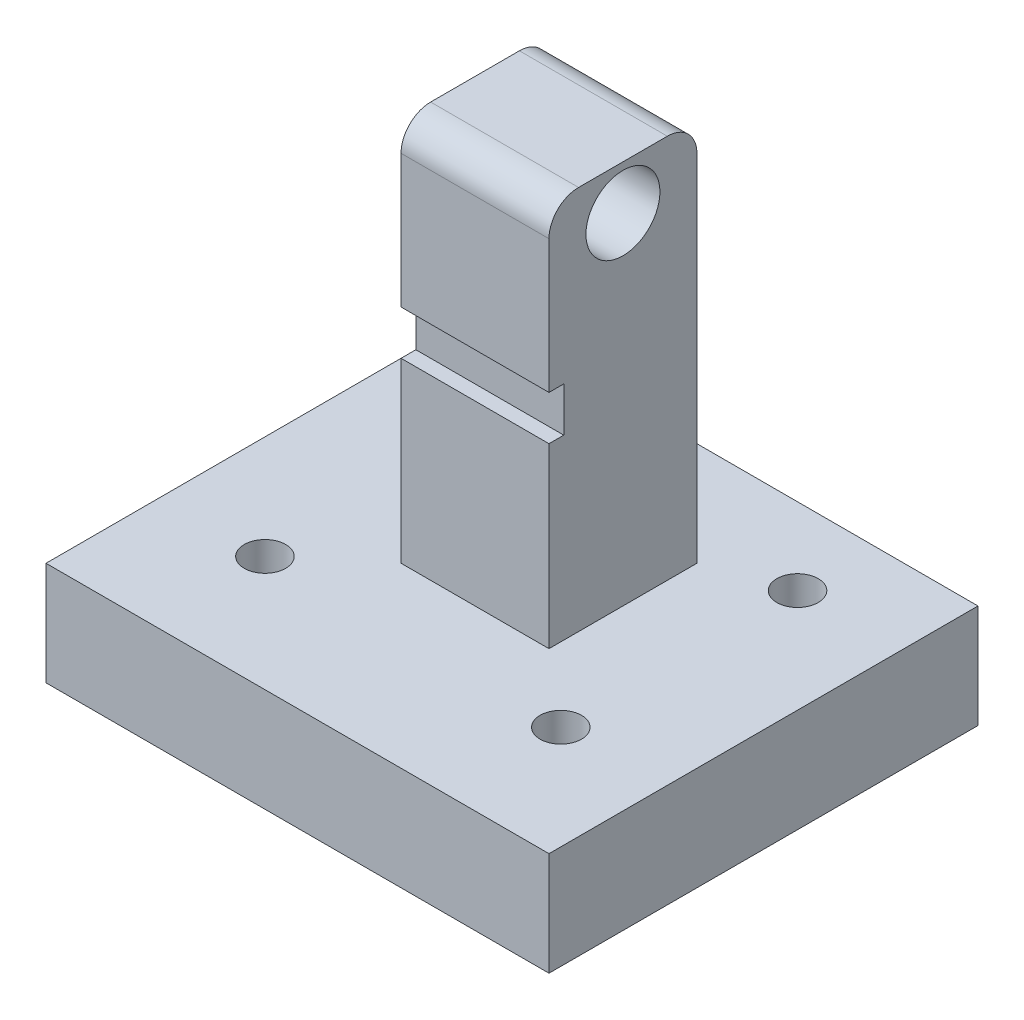
ISO-10303-21;
HEADER;
FILE_DESCRIPTION(('STEP AP214'),'2;1');
FILE_NAME('part.step','',(''),(''),'','','');
FILE_SCHEMA(('AUTOMOTIVE_DESIGN { 1 0 10303 214 1 1 1 1 }'));
ENDSEC;
DATA;
#1=APPLICATION_CONTEXT('core data for automotive mechanical design processes');
#2=APPLICATION_PROTOCOL_DEFINITION('international standard','automotive_design',2000,#1);
#3=PRODUCT_CONTEXT('',#1,'mechanical');
#4=PRODUCT('Part','Part','',(#3));
#5=PRODUCT_RELATED_PRODUCT_CATEGORY('part','',(#4));
#6=PRODUCT_DEFINITION_FORMATION('','',#4);
#7=PRODUCT_DEFINITION_CONTEXT('part definition',#1,'design');
#8=PRODUCT_DEFINITION('design','',#6,#7);
#9=PRODUCT_DEFINITION_SHAPE('','',#8);
#10=(LENGTH_UNIT() NAMED_UNIT(*) SI_UNIT(.MILLI.,.METRE.));
#11=(NAMED_UNIT(*) PLANE_ANGLE_UNIT() SI_UNIT($,.RADIAN.));
#12=(NAMED_UNIT(*) SI_UNIT($,.STERADIAN.) SOLID_ANGLE_UNIT());
#13=UNCERTAINTY_MEASURE_WITH_UNIT(LENGTH_MEASURE(1.E-05),#10,'distance_accuracy_value','');
#14=(GEOMETRIC_REPRESENTATION_CONTEXT(3) GLOBAL_UNCERTAINTY_ASSIGNED_CONTEXT((#13)) GLOBAL_UNIT_ASSIGNED_CONTEXT((#10,
#11,#12)) REPRESENTATION_CONTEXT('',''));
#15=CARTESIAN_POINT('',(0.,0.,0.));
#16=DIRECTION('',(0.,0.,1.));
#17=DIRECTION('',(1.,0.,0.));
#18=AXIS2_PLACEMENT_3D('',#15,#16,#17);
#19=CARTESIAN_POINT('',(0.,0.,10.));
#20=DIRECTION('',(0.,0.,1.));
#21=DIRECTION('',(1.,0.,0.));
#22=AXIS2_PLACEMENT_3D('',#19,#20,#21);
#23=PLANE('',#22);
#24=DIRECTION('',(-1.,0.,0.));
#25=VECTOR('',#24,1.);
#26=CARTESIAN_POINT('',(-61.75,-71.3750000000001,10.));
#27=LINE('',#26,#25);
#28=CARTESIAN_POINT('',(-51.75,-71.3750000000001,10.));
#29=VERTEX_POINT('',#28);
#30=CARTESIAN_POINT('',(-61.75,-71.3750000000001,10.));
#31=VERTEX_POINT('',#30);
#32=EDGE_CURVE('E166',#29,#31,#27,.T.);
#33=ORIENTED_EDGE('',*,*,#32,.F.);
#34=DIRECTION('',(0.,1.,0.));
#35=VECTOR('',#34,1.);
#36=CARTESIAN_POINT('',(-51.75,0.,10.));
#37=LINE('',#36,#35);
#38=CARTESIAN_POINT('',(-51.75,-62.3750000000001,10.));
#39=VERTEX_POINT('',#38);
#40=EDGE_CURVE('E266',#29,#39,#37,.T.);
#41=ORIENTED_EDGE('',*,*,#40,.T.);
#42=DIRECTION('',(-1.,0.,0.));
#43=VECTOR('',#42,1.);
#44=CARTESIAN_POINT('',(-61.75,-62.3750000000001,10.));
#45=LINE('',#44,#43);
#46=CARTESIAN_POINT('',(-61.75,-62.3750000000001,10.));
#47=VERTEX_POINT('',#46);
#48=EDGE_CURVE('E299',#39,#47,#45,.T.);
#49=ORIENTED_EDGE('',*,*,#48,.T.);
#50=DIRECTION('',(0.,-1.,0.));
#51=VECTOR('',#50,1.);
#52=CARTESIAN_POINT('',(-61.75,0.,10.));
#53=LINE('',#52,#51);
#54=EDGE_CURVE('E274',#47,#31,#53,.T.);
#55=ORIENTED_EDGE('',*,*,#54,.T.);
#56=EDGE_LOOP('',(#33,#41,#49,#55));
#57=FACE_BOUND('',#56,.T.);
#58=ADVANCED_FACE('F47',(#57),#23,.T.);
#59=CARTESIAN_POINT('',(-73.75,88.375,10.));
#60=DIRECTION('',(1.,0.,0.));
#61=DIRECTION('',(0.,1.,0.));
#62=AXIS2_PLACEMENT_3D('',#59,#60,#61);
#63=PLANE('',#62);
#64=DIRECTION('',(0.,0.,1.));
#65=VECTOR('',#64,1.);
#66=CARTESIAN_POINT('',(-73.75,-86.3750000000001,-7.));
#67=LINE('',#66,#65);
#68=CARTESIAN_POINT('',(-73.75,-86.3750000000001,-7.));
#69=VERTEX_POINT('',#68);
#70=CARTESIAN_POINT('',(-73.75,-86.3750000000001,22.));
#71=VERTEX_POINT('',#70);
#72=EDGE_CURVE('E72',#69,#71,#67,.T.);
#73=ORIENTED_EDGE('',*,*,#72,.F.);
#74=DIRECTION('',(0.,-1.,0.));
#75=VECTOR('',#74,1.);
#76=CARTESIAN_POINT('',(-73.75,-88.3750000000001,-7.));
#77=LINE('',#76,#75);
#78=CARTESIAN_POINT('',(-73.75,-93.375,-7.));
#79=VERTEX_POINT('',#78);
#80=EDGE_CURVE('E279',#69,#79,#77,.T.);
#81=ORIENTED_EDGE('',*,*,#80,.T.);
#82=DIRECTION('',(0.,0.,-1.));
#83=VECTOR('',#82,1.);
#84=CARTESIAN_POINT('',(-73.75,-93.375,22.));
#85=LINE('',#84,#83);
#86=CARTESIAN_POINT('',(-73.75,-93.375,22.));
#87=VERTEX_POINT('',#86);
#88=EDGE_CURVE('E237',#87,#79,#85,.T.);
#89=ORIENTED_EDGE('',*,*,#88,.F.);
#90=DIRECTION('',(0.,1.,0.));
#91=VECTOR('',#90,1.);
#92=CARTESIAN_POINT('',(-73.75,-88.3750000000001,22.));
#93=LINE('',#92,#91);
#94=EDGE_CURVE('E282',#87,#71,#93,.T.);
#95=ORIENTED_EDGE('',*,*,#94,.T.);
#96=EDGE_LOOP('',(#73,#81,#89,#95));
#97=FACE_BOUND('',#96,.T.);
#98=ADVANCED_FACE('F359',(#97),#63,.F.);
#99=CARTESIAN_POINT('',(-39.75,0.,0.));
#100=DIRECTION('',(-1.,0.,0.));
#101=DIRECTION('',(0.,0.,1.));
#102=AXIS2_PLACEMENT_3D('',#99,#100,#101);
#103=PLANE('',#102);
#104=DIRECTION('',(0.,0.,-1.));
#105=VECTOR('',#104,1.);
#106=CARTESIAN_POINT('',(-39.75,-86.3750000000001,-7.));
#107=LINE('',#106,#105);
#108=CARTESIAN_POINT('',(-39.75,-86.3750000000001,22.));
#109=VERTEX_POINT('',#108);
#110=CARTESIAN_POINT('',(-39.75,-86.3750000000001,-7.));
#111=VERTEX_POINT('',#110);
#112=EDGE_CURVE('E203',#109,#111,#107,.T.);
#113=ORIENTED_EDGE('',*,*,#112,.F.);
#114=DIRECTION('',(0.,1.,0.));
#115=VECTOR('',#114,1.);
#116=CARTESIAN_POINT('',(-39.75,-88.3750000000001,22.));
#117=LINE('',#116,#115);
#118=CARTESIAN_POINT('',(-39.75,-93.375,22.));
#119=VERTEX_POINT('',#118);
#120=EDGE_CURVE('E283',#119,#109,#117,.T.);
#121=ORIENTED_EDGE('',*,*,#120,.F.);
#122=DIRECTION('',(0.,0.,1.));
#123=VECTOR('',#122,1.);
#124=CARTESIAN_POINT('',(-39.75,-93.375,22.));
#125=LINE('',#124,#123);
#126=CARTESIAN_POINT('',(-39.75,-93.375,-7.));
#127=VERTEX_POINT('',#126);
#128=EDGE_CURVE('E245',#127,#119,#125,.T.);
#129=ORIENTED_EDGE('',*,*,#128,.F.);
#130=DIRECTION('',(0.,-1.,0.));
#131=VECTOR('',#130,1.);
#132=CARTESIAN_POINT('',(-39.75,-88.3750000000001,-7.));
#133=LINE('',#132,#131);
#134=EDGE_CURVE('E278',#111,#127,#133,.T.);
#135=ORIENTED_EDGE('',*,*,#134,.F.);
#136=EDGE_LOOP('',(#113,#121,#129,#135));
#137=FACE_BOUND('',#136,.T.);
#138=ADVANCED_FACE('F367',(#137),#103,.F.);
#139=CARTESIAN_POINT('',(-39.75,-88.3750000000001,-7.));
#140=DIRECTION('',(0.,0.,-1.));
#141=DIRECTION('',(0.,1.,0.));
#142=AXIS2_PLACEMENT_3D('',#139,#140,#141);
#143=PLANE('',#142);
#144=ORIENTED_EDGE('',*,*,#80,.F.);
#145=DIRECTION('',(-1.,0.,0.));
#146=VECTOR('',#145,1.);
#147=CARTESIAN_POINT('',(-73.75,-86.3750000000001,-7.));
#148=LINE('',#147,#146);
#149=EDGE_CURVE('E206',#111,#69,#148,.T.);
#150=ORIENTED_EDGE('',*,*,#149,.F.);
#151=ORIENTED_EDGE('',*,*,#134,.T.);
#152=DIRECTION('',(1.,0.,0.));
#153=VECTOR('',#152,1.);
#154=CARTESIAN_POINT('',(-73.75,-93.375,-7.));
#155=LINE('',#154,#153);
#156=EDGE_CURVE('E241',#79,#127,#155,.T.);
#157=ORIENTED_EDGE('',*,*,#156,.F.);
#158=EDGE_LOOP('',(#144,#150,#151,#157));
#159=FACE_BOUND('',#158,.T.);
#160=ADVANCED_FACE('F408',(#159),#143,.T.);
#161=CARTESIAN_POINT('',(-39.75,-88.3750000000001,22.));
#162=DIRECTION('',(0.,0.,1.));
#163=DIRECTION('',(1.,0.,0.));
#164=AXIS2_PLACEMENT_3D('',#161,#162,#163);
#165=PLANE('',#164);
#166=ORIENTED_EDGE('',*,*,#120,.T.);
#167=DIRECTION('',(1.,0.,0.));
#168=VECTOR('',#167,1.);
#169=CARTESIAN_POINT('',(-73.75,-86.3750000000001,22.));
#170=LINE('',#169,#168);
#171=EDGE_CURVE('E200',#71,#109,#170,.T.);
#172=ORIENTED_EDGE('',*,*,#171,.F.);
#173=ORIENTED_EDGE('',*,*,#94,.F.);
#174=DIRECTION('',(-1.,0.,0.));
#175=VECTOR('',#174,1.);
#176=CARTESIAN_POINT('',(-73.75,-93.375,22.));
#177=LINE('',#176,#175);
#178=EDGE_CURVE('E249',#119,#87,#177,.T.);
#179=ORIENTED_EDGE('',*,*,#178,.F.);
#180=EDGE_LOOP('',(#166,#172,#173,#179));
#181=FACE_BOUND('',#180,.T.);
#182=ADVANCED_FACE('F405',(#181),#165,.T.);
#183=CARTESIAN_POINT('',(-46.75,-54.375,-1.8));
#184=DIRECTION('',(0.,-1.,0.));
#185=DIRECTION('',(0.,0.,-1.));
#186=AXIS2_PLACEMENT_3D('',#183,#184,#185);
#187=CYLINDRICAL_SURFACE('',#186,1.4);
#188=CARTESIAN_POINT('',(-46.7499999999999,-93.375,-1.80000000000014));
#189=DIRECTION('',(0.,-1.,0.));
#190=DIRECTION('',(0.,0.,-1.));
#191=AXIS2_PLACEMENT_3D('',#188,#189,#190);
#192=CIRCLE('',#191,1.39999999999999);
#193=CARTESIAN_POINT('',(-46.7499999999999,-93.375,-3.20000000000013));
#194=VERTEX_POINT('',#193);
#195=EDGE_CURVE('E225',#194,#194,#192,.T.);
#196=ORIENTED_EDGE('',*,*,#195,.T.);
#197=EDGE_LOOP('',(#196));
#198=FACE_BOUND('',#197,.T.);
#199=CARTESIAN_POINT('',(-46.75,-86.3750000000001,-1.8));
#200=DIRECTION('',(0.,1.,0.));
#201=DIRECTION('',(0.,0.,1.));
#202=AXIS2_PLACEMENT_3D('',#199,#200,#201);
#203=CIRCLE('',#202,1.4);
#204=CARTESIAN_POINT('',(-46.75,-86.3750000000001,-0.400000000000005));
#205=VERTEX_POINT('',#204);
#206=EDGE_CURVE('E217',#205,#205,#203,.F.);
#207=ORIENTED_EDGE('',*,*,#206,.F.);
#208=EDGE_LOOP('',(#207));
#209=FACE_BOUND('',#208,.T.);
#210=ADVANCED_FACE('F402',(#198,#209),#187,.F.);
#211=CARTESIAN_POINT('',(-66.75,-54.375,-1.80000000000014));
#212=DIRECTION('',(0.,-1.,0.));
#213=DIRECTION('',(0.,0.,-1.));
#214=AXIS2_PLACEMENT_3D('',#211,#212,#213);
#215=CYLINDRICAL_SURFACE('',#214,1.39999999999999);
#216=CARTESIAN_POINT('',(-66.7499999999999,-93.375,-1.80000000000014));
#217=DIRECTION('',(0.,-1.,0.));
#218=DIRECTION('',(0.,0.,-1.));
#219=AXIS2_PLACEMENT_3D('',#216,#217,#218);
#220=CIRCLE('',#219,1.39999999999999);
#221=CARTESIAN_POINT('',(-66.7499999999999,-93.375,-3.20000000000013));
#222=VERTEX_POINT('',#221);
#223=EDGE_CURVE('E221',#222,#222,#220,.T.);
#224=ORIENTED_EDGE('',*,*,#223,.T.);
#225=EDGE_LOOP('',(#224));
#226=FACE_BOUND('',#225,.T.);
#227=CARTESIAN_POINT('',(-66.75,-86.3750000000001,-1.80000000000014));
#228=DIRECTION('',(0.,1.,0.));
#229=DIRECTION('',(0.,0.,1.));
#230=AXIS2_PLACEMENT_3D('',#227,#228,#229);
#231=CIRCLE('',#230,1.39999999999999);
#232=CARTESIAN_POINT('',(-66.75,-86.3750000000001,-0.400000000000151));
#233=VERTEX_POINT('',#232);
#234=EDGE_CURVE('E213',#233,#233,#231,.F.);
#235=ORIENTED_EDGE('',*,*,#234,.F.);
#236=EDGE_LOOP('',(#235));
#237=FACE_BOUND('',#236,.T.);
#238=ADVANCED_FACE('F440',(#226,#237),#215,.F.);
#239=CARTESIAN_POINT('',(-66.75,-54.375,14.1999999999999));
#240=DIRECTION('',(0.,-1.,0.));
#241=DIRECTION('',(0.,0.,-1.));
#242=AXIS2_PLACEMENT_3D('',#239,#240,#241);
#243=CYLINDRICAL_SURFACE('',#242,1.39999999999999);
#244=CARTESIAN_POINT('',(-66.75,-93.375,14.1999999999999));
#245=DIRECTION('',(0.,-1.,0.));
#246=DIRECTION('',(0.,0.,-1.));
#247=AXIS2_PLACEMENT_3D('',#244,#245,#246);
#248=CIRCLE('',#247,1.39999999999999);
#249=CARTESIAN_POINT('',(-66.75,-93.375,12.7999999999999));
#250=VERTEX_POINT('',#249);
#251=EDGE_CURVE('E233',#250,#250,#248,.T.);
#252=ORIENTED_EDGE('',*,*,#251,.T.);
#253=EDGE_LOOP('',(#252));
#254=FACE_BOUND('',#253,.T.);
#255=CARTESIAN_POINT('',(-66.75,-86.3750000000001,14.1999999999999));
#256=DIRECTION('',(0.,1.,0.));
#257=DIRECTION('',(0.,0.,1.));
#258=AXIS2_PLACEMENT_3D('',#255,#256,#257);
#259=CIRCLE('',#258,1.39999999999999);
#260=CARTESIAN_POINT('',(-66.75,-86.3750000000001,15.5999999999999));
#261=VERTEX_POINT('',#260);
#262=EDGE_CURVE('E209',#261,#261,#259,.F.);
#263=ORIENTED_EDGE('',*,*,#262,.F.);
#264=EDGE_LOOP('',(#263));
#265=FACE_BOUND('',#264,.T.);
#266=ADVANCED_FACE('F445',(#254,#265),#243,.F.);
#267=CARTESIAN_POINT('',(-46.75,-54.375,14.2));
#268=DIRECTION('',(0.,-1.,0.));
#269=DIRECTION('',(0.,0.,-1.));
#270=AXIS2_PLACEMENT_3D('',#267,#268,#269);
#271=CYLINDRICAL_SURFACE('',#270,1.4);
#272=CARTESIAN_POINT('',(-46.75,-93.375,14.1999999999999));
#273=DIRECTION('',(0.,-1.,0.));
#274=DIRECTION('',(0.,0.,-1.));
#275=AXIS2_PLACEMENT_3D('',#272,#273,#274);
#276=CIRCLE('',#275,1.39999999999999);
#277=CARTESIAN_POINT('',(-46.75,-93.375,12.7999999999999));
#278=VERTEX_POINT('',#277);
#279=EDGE_CURVE('E229',#278,#278,#276,.T.);
#280=ORIENTED_EDGE('',*,*,#279,.T.);
#281=EDGE_LOOP('',(#280));
#282=FACE_BOUND('',#281,.T.);
#283=CARTESIAN_POINT('',(-46.75,-86.3750000000001,14.2));
#284=DIRECTION('',(0.,1.,0.));
#285=DIRECTION('',(0.,0.,1.));
#286=AXIS2_PLACEMENT_3D('',#283,#284,#285);
#287=CIRCLE('',#286,1.4);
#288=CARTESIAN_POINT('',(-46.75,-86.3750000000001,15.6));
#289=VERTEX_POINT('',#288);
#290=EDGE_CURVE('E51',#289,#289,#287,.F.);
#291=ORIENTED_EDGE('',*,*,#290,.F.);
#292=EDGE_LOOP('',(#291));
#293=FACE_BOUND('',#292,.T.);
#294=ADVANCED_FACE('F452',(#282,#293),#271,.F.);
#295=CARTESIAN_POINT('',(0.,-93.375,0.));
#296=DIRECTION('',(0.,-1.,0.));
#297=DIRECTION('',(0.,0.,-1.));
#298=AXIS2_PLACEMENT_3D('',#295,#296,#297);
#299=PLANE('',#298);
#300=ORIENTED_EDGE('',*,*,#195,.F.);
#301=EDGE_LOOP('',(#300));
#302=FACE_BOUND('',#301,.T.);
#303=ORIENTED_EDGE('',*,*,#251,.F.);
#304=EDGE_LOOP('',(#303));
#305=FACE_BOUND('',#304,.T.);
#306=ORIENTED_EDGE('',*,*,#88,.T.);
#307=ORIENTED_EDGE('',*,*,#156,.T.);
#308=ORIENTED_EDGE('',*,*,#128,.T.);
#309=ORIENTED_EDGE('',*,*,#178,.T.);
#310=EDGE_LOOP('',(#306,#307,#308,#309));
#311=FACE_BOUND('',#310,.T.);
#312=ORIENTED_EDGE('',*,*,#279,.F.);
#313=EDGE_LOOP('',(#312));
#314=FACE_BOUND('',#313,.T.);
#315=ORIENTED_EDGE('',*,*,#223,.F.);
#316=EDGE_LOOP('',(#315));
#317=FACE_BOUND('',#316,.T.);
#318=ADVANCED_FACE('F423',(#302,#305,#311,#314,#317),#299,.T.);
#319=CARTESIAN_POINT('',(0.,-86.3750000000001,0.));
#320=DIRECTION('',(0.,1.,0.));
#321=DIRECTION('',(0.,0.,1.));
#322=AXIS2_PLACEMENT_3D('',#319,#320,#321);
#323=PLANE('',#322);
#324=DIRECTION('',(-1.,0.,0.));
#325=VECTOR('',#324,1.);
#326=CARTESIAN_POINT('',(-61.75,-86.3750000000001,0.));
#327=LINE('',#326,#325);
#328=CARTESIAN_POINT('',(-51.75,-86.3750000000001,0.));
#329=VERTEX_POINT('',#328);
#330=CARTESIAN_POINT('',(-61.75,-86.3750000000001,0.));
#331=VERTEX_POINT('',#330);
#332=EDGE_CURVE('E194',#329,#331,#327,.T.);
#333=ORIENTED_EDGE('',*,*,#332,.F.);
#334=DIRECTION('',(0.,0.,-1.));
#335=VECTOR('',#334,1.);
#336=CARTESIAN_POINT('',(-51.75,-86.3750000000001,0.));
#337=LINE('',#336,#335);
#338=CARTESIAN_POINT('',(-51.75,-86.3750000000001,10.));
#339=VERTEX_POINT('',#338);
#340=EDGE_CURVE('E190',#339,#329,#337,.T.);
#341=ORIENTED_EDGE('',*,*,#340,.F.);
#342=DIRECTION('',(1.,0.,0.));
#343=VECTOR('',#342,1.);
#344=CARTESIAN_POINT('',(-61.75,-86.3750000000001,10.));
#345=LINE('',#344,#343);
#346=CARTESIAN_POINT('',(-61.75,-86.3750000000001,10.));
#347=VERTEX_POINT('',#346);
#348=EDGE_CURVE('E185',#347,#339,#345,.T.);
#349=ORIENTED_EDGE('',*,*,#348,.F.);
#350=DIRECTION('',(0.,0.,1.));
#351=VECTOR('',#350,1.);
#352=CARTESIAN_POINT('',(-61.75,-86.3750000000001,0.));
#353=LINE('',#352,#351);
#354=EDGE_CURVE('E182',#331,#347,#353,.T.);
#355=ORIENTED_EDGE('',*,*,#354,.F.);
#356=EDGE_LOOP('',(#333,#341,#349,#355));
#357=FACE_BOUND('',#356,.T.);
#358=ORIENTED_EDGE('',*,*,#72,.T.);
#359=ORIENTED_EDGE('',*,*,#171,.T.);
#360=ORIENTED_EDGE('',*,*,#112,.T.);
#361=ORIENTED_EDGE('',*,*,#149,.T.);
#362=EDGE_LOOP('',(#358,#359,#360,#361));
#363=FACE_BOUND('',#362,.T.);
#364=ORIENTED_EDGE('',*,*,#290,.T.);
#365=EDGE_LOOP('',(#364));
#366=FACE_BOUND('',#365,.T.);
#367=ORIENTED_EDGE('',*,*,#262,.T.);
#368=EDGE_LOOP('',(#367));
#369=FACE_BOUND('',#368,.T.);
#370=ORIENTED_EDGE('',*,*,#234,.T.);
#371=EDGE_LOOP('',(#370));
#372=FACE_BOUND('',#371,.T.);
#373=ORIENTED_EDGE('',*,*,#206,.T.);
#374=EDGE_LOOP('',(#373));
#375=FACE_BOUND('',#374,.T.);
#376=ADVANCED_FACE('F382',(#357,#363,#366,#369,#372,#375),#323,.T.);
#377=CARTESIAN_POINT('',(-39.75,-63.3750000000001,5.));
#378=DIRECTION('',(-1.,0.,0.));
#379=DIRECTION('',(0.,0.,1.));
#380=AXIS2_PLACEMENT_3D('',#377,#378,#379);
#381=CYLINDRICAL_SURFACE('',#380,2.5);
#382=CARTESIAN_POINT('',(-61.75,-63.3750000000001,5.));
#383=DIRECTION('',(-1.,0.,0.));
#384=DIRECTION('',(0.,0.,1.));
#385=AXIS2_PLACEMENT_3D('',#382,#383,#384);
#386=CIRCLE('',#385,2.5);
#387=CARTESIAN_POINT('',(-61.75,-63.3750000000001,7.5));
#388=VERTEX_POINT('',#387);
#389=EDGE_CURVE('E258',#388,#388,#386,.T.);
#390=ORIENTED_EDGE('',*,*,#389,.T.);
#391=EDGE_LOOP('',(#390));
#392=FACE_BOUND('',#391,.T.);
#393=CARTESIAN_POINT('',(-51.75,-63.3750000000001,5.));
#394=DIRECTION('',(1.,0.,0.));
#395=DIRECTION('',(0.,0.,-1.));
#396=AXIS2_PLACEMENT_3D('',#393,#394,#395);
#397=CIRCLE('',#396,2.5);
#398=CARTESIAN_POINT('',(-51.75,-63.3750000000001,2.5));
#399=VERTEX_POINT('',#398);
#400=EDGE_CURVE('E257',#399,#399,#397,.T.);
#401=ORIENTED_EDGE('',*,*,#400,.T.);
#402=EDGE_LOOP('',(#401));
#403=FACE_BOUND('',#402,.T.);
#404=ADVANCED_FACE('F393',(#392,#403),#381,.F.);
#405=CARTESIAN_POINT('',(-39.75,-60.3750000000001,0.));
#406=DIRECTION('',(0.,-1.,0.));
#407=DIRECTION('',(0.,0.,-1.));
#408=AXIS2_PLACEMENT_3D('',#405,#406,#407);
#409=PLANE('',#408);
#410=DIRECTION('',(0.,0.,1.));
#411=VECTOR('',#410,1.);
#412=CARTESIAN_POINT('',(-61.75,-60.3750000000001,66.6645602247818));
#413=LINE('',#412,#411);
#414=CARTESIAN_POINT('',(-61.75,-60.3750000000001,2.));
#415=VERTEX_POINT('',#414);
#416=CARTESIAN_POINT('',(-61.75,-60.3750000000001,8.));
#417=VERTEX_POINT('',#416);
#418=EDGE_CURVE('E253',#415,#417,#413,.T.);
#419=ORIENTED_EDGE('',*,*,#418,.T.);
#420=DIRECTION('',(-1.,0.,0.));
#421=VECTOR('',#420,1.);
#422=CARTESIAN_POINT('',(-51.75,-60.3750000000001,8.));
#423=LINE('',#422,#421);
#424=CARTESIAN_POINT('',(-51.75,-60.3750000000001,8.));
#425=VERTEX_POINT('',#424);
#426=EDGE_CURVE('E313',#417,#425,#423,.F.);
#427=ORIENTED_EDGE('',*,*,#426,.T.);
#428=DIRECTION('',(0.,0.,-1.));
#429=VECTOR('',#428,1.);
#430=CARTESIAN_POINT('',(-51.75,-60.3750000000001,66.6645602247818));
#431=LINE('',#430,#429);
#432=CARTESIAN_POINT('',(-51.75,-60.3750000000001,2.));
#433=VERTEX_POINT('',#432);
#434=EDGE_CURVE('E287',#425,#433,#431,.T.);
#435=ORIENTED_EDGE('',*,*,#434,.T.);
#436=DIRECTION('',(-1.,0.,0.));
#437=VECTOR('',#436,1.);
#438=CARTESIAN_POINT('',(-39.75,-60.3750000000001,2.));
#439=LINE('',#438,#437);
#440=EDGE_CURVE('E309',#433,#415,#439,.T.);
#441=ORIENTED_EDGE('',*,*,#440,.T.);
#442=EDGE_LOOP('',(#419,#427,#435,#441));
#443=FACE_BOUND('',#442,.T.);
#444=ADVANCED_FACE('F391',(#443),#409,.F.);
#445=CARTESIAN_POINT('',(-39.75,-62.3750000000001,2.));
#446=DIRECTION('',(-1.,0.,0.));
#447=DIRECTION('',(0.,0.,1.));
#448=AXIS2_PLACEMENT_3D('',#445,#446,#447);
#449=CYLINDRICAL_SURFACE('',#448,2.);
#450=CARTESIAN_POINT('',(-51.75,-62.3750000000001,2.));
#451=DIRECTION('',(1.,0.,0.));
#452=DIRECTION('',(0.,0.,-1.));
#453=AXIS2_PLACEMENT_3D('',#450,#451,#452);
#454=CIRCLE('',#453,2.);
#455=CARTESIAN_POINT('',(-51.75,-62.3750000000001,0.));
#456=VERTEX_POINT('',#455);
#457=EDGE_CURVE('E316',#456,#433,#454,.T.);
#458=ORIENTED_EDGE('',*,*,#457,.F.);
#459=DIRECTION('',(-1.,0.,0.));
#460=VECTOR('',#459,1.);
#461=CARTESIAN_POINT('',(0.,-62.3750000000001,0.));
#462=LINE('',#461,#460);
#463=CARTESIAN_POINT('',(-61.75,-62.3750000000001,0.));
#464=VERTEX_POINT('',#463);
#465=EDGE_CURVE('E11',#464,#456,#462,.F.);
#466=ORIENTED_EDGE('',*,*,#465,.F.);
#467=CARTESIAN_POINT('',(-61.75,-62.3750000000001,2.));
#468=DIRECTION('',(-1.,0.,0.));
#469=DIRECTION('',(0.,0.,1.));
#470=AXIS2_PLACEMENT_3D('',#467,#468,#469);
#471=CIRCLE('',#470,2.);
#472=EDGE_CURVE('E303',#415,#464,#471,.T.);
#473=ORIENTED_EDGE('',*,*,#472,.F.);
#474=ORIENTED_EDGE('',*,*,#440,.F.);
#475=EDGE_LOOP('',(#458,#466,#473,#474));
#476=FACE_BOUND('',#475,.T.);
#477=ADVANCED_FACE('F49',(#476),#449,.T.);
#478=CARTESIAN_POINT('',(0.,-62.3750000000001,8.));
#479=DIRECTION('',(1.,0.,0.));
#480=DIRECTION('',(0.,0.,-1.));
#481=AXIS2_PLACEMENT_3D('',#478,#479,#480);
#482=CYLINDRICAL_SURFACE('',#481,2.);
#483=CARTESIAN_POINT('',(-51.75,-62.3750000000001,8.));
#484=DIRECTION('',(1.,0.,0.));
#485=DIRECTION('',(0.,0.,-1.));
#486=AXIS2_PLACEMENT_3D('',#483,#484,#485);
#487=CIRCLE('',#486,2.);
#488=EDGE_CURVE('E57',#425,#39,#487,.T.);
#489=ORIENTED_EDGE('',*,*,#488,.F.);
#490=ORIENTED_EDGE('',*,*,#426,.F.);
#491=CARTESIAN_POINT('',(-61.75,-62.3750000000001,8.));
#492=DIRECTION('',(-1.,0.,0.));
#493=DIRECTION('',(0.,0.,1.));
#494=AXIS2_PLACEMENT_3D('',#491,#492,#493);
#495=CIRCLE('',#494,2.);
#496=EDGE_CURVE('E306',#47,#417,#495,.T.);
#497=ORIENTED_EDGE('',*,*,#496,.F.);
#498=ORIENTED_EDGE('',*,*,#48,.F.);
#499=EDGE_LOOP('',(#489,#490,#497,#498));
#500=FACE_BOUND('',#499,.T.);
#501=ADVANCED_FACE('F331',(#500),#482,.T.);
#502=DIRECTION('',(1.,0.,0.));
#503=VECTOR('',#502,1.);
#504=CARTESIAN_POINT('',(-61.75,-74.3750000000001,10.));
#505=LINE('',#504,#503);
#506=CARTESIAN_POINT('',(-61.75,-74.3750000000001,10.));
#507=VERTEX_POINT('',#506);
#508=CARTESIAN_POINT('',(-51.75,-74.3750000000001,10.));
#509=VERTEX_POINT('',#508);
#510=EDGE_CURVE('E343',#507,#509,#505,.T.);
#511=ORIENTED_EDGE('',*,*,#510,.F.);
#512=EDGE_CURVE('E172',#507,#347,#53,.T.);
#513=ORIENTED_EDGE('',*,*,#512,.T.);
#514=ORIENTED_EDGE('',*,*,#348,.T.);
#515=EDGE_CURVE('E267',#339,#509,#37,.T.);
#516=ORIENTED_EDGE('',*,*,#515,.T.);
#517=EDGE_LOOP('',(#511,#513,#514,#516));
#518=FACE_BOUND('',#517,.T.);
#519=ADVANCED_FACE('F361',(#518),#23,.T.);
#520=CARTESIAN_POINT('',(-51.75,0.,66.6645602247818));
#521=DIRECTION('',(1.,0.,0.));
#522=DIRECTION('',(0.,0.,-1.));
#523=AXIS2_PLACEMENT_3D('',#520,#521,#522);
#524=PLANE('',#523);
#525=DIRECTION('',(0.,0.,1.));
#526=VECTOR('',#525,1.);
#527=CARTESIAN_POINT('',(-51.75,-71.3750000000001,9.));
#528=LINE('',#527,#526);
#529=CARTESIAN_POINT('',(-51.75,-71.3750000000001,9.));
#530=VERTEX_POINT('',#529);
#531=EDGE_CURVE('E177',#530,#29,#528,.T.);
#532=ORIENTED_EDGE('',*,*,#531,.F.);
#533=DIRECTION('',(0.,1.,0.));
#534=VECTOR('',#533,1.);
#535=CARTESIAN_POINT('',(-51.75,-71.3750000000001,9.));
#536=LINE('',#535,#534);
#537=CARTESIAN_POINT('',(-51.75,-74.3750000000001,9.));
#538=VERTEX_POINT('',#537);
#539=EDGE_CURVE('E158',#538,#530,#536,.T.);
#540=ORIENTED_EDGE('',*,*,#539,.F.);
#541=DIRECTION('',(0.,0.,1.));
#542=VECTOR('',#541,1.);
#543=CARTESIAN_POINT('',(-51.75,-74.3750000000001,9.));
#544=LINE('',#543,#542);
#545=EDGE_CURVE('E155',#538,#509,#544,.T.);
#546=ORIENTED_EDGE('',*,*,#545,.T.);
#547=ORIENTED_EDGE('',*,*,#515,.F.);
#548=ORIENTED_EDGE('',*,*,#340,.T.);
#549=DIRECTION('',(0.,1.,0.));
#550=VECTOR('',#549,1.);
#551=CARTESIAN_POINT('',(-51.75,0.,0.));
#552=LINE('',#551,#550);
#553=EDGE_CURVE('E262',#329,#456,#552,.T.);
#554=ORIENTED_EDGE('',*,*,#553,.T.);
#555=ORIENTED_EDGE('',*,*,#457,.T.);
#556=ORIENTED_EDGE('',*,*,#434,.F.);
#557=ORIENTED_EDGE('',*,*,#488,.T.);
#558=ORIENTED_EDGE('',*,*,#40,.F.);
#559=EDGE_LOOP('',(#532,#540,#546,#547,#548,#554,#555,#556,#557,#558));
#560=FACE_BOUND('',#559,.T.);
#561=ORIENTED_EDGE('',*,*,#400,.F.);
#562=EDGE_LOOP('',(#561));
#563=FACE_BOUND('',#562,.T.);
#564=ADVANCED_FACE('F327',(#560,#563),#524,.T.);
#565=CARTESIAN_POINT('',(0.,0.,0.));
#566=DIRECTION('',(0.,0.,1.));
#567=DIRECTION('',(1.,0.,0.));
#568=AXIS2_PLACEMENT_3D('',#565,#566,#567);
#569=PLANE('',#568);
#570=DIRECTION('',(0.,-1.,0.));
#571=VECTOR('',#570,1.);
#572=CARTESIAN_POINT('',(-61.75,0.,0.));
#573=LINE('',#572,#571);
#574=EDGE_CURVE('E271',#464,#331,#573,.T.);
#575=ORIENTED_EDGE('',*,*,#574,.F.);
#576=ORIENTED_EDGE('',*,*,#465,.T.);
#577=ORIENTED_EDGE('',*,*,#553,.F.);
#578=ORIENTED_EDGE('',*,*,#332,.T.);
#579=EDGE_LOOP('',(#575,#576,#577,#578));
#580=FACE_BOUND('',#579,.T.);
#581=ADVANCED_FACE('F355',(#580),#569,.F.);
#582=CARTESIAN_POINT('',(-61.75,0.,66.6645602247818));
#583=DIRECTION('',(-1.,0.,0.));
#584=DIRECTION('',(0.,0.,1.));
#585=AXIS2_PLACEMENT_3D('',#582,#583,#584);
#586=PLANE('',#585);
#587=DIRECTION('',(0.,0.,1.));
#588=VECTOR('',#587,1.);
#589=CARTESIAN_POINT('',(-61.75,-71.3750000000001,9.));
#590=LINE('',#589,#588);
#591=CARTESIAN_POINT('',(-61.75,-71.3750000000001,9.));
#592=VERTEX_POINT('',#591);
#593=EDGE_CURVE('E186',#592,#31,#590,.T.);
#594=ORIENTED_EDGE('',*,*,#593,.T.);
#595=ORIENTED_EDGE('',*,*,#54,.F.);
#596=ORIENTED_EDGE('',*,*,#496,.T.);
#597=ORIENTED_EDGE('',*,*,#418,.F.);
#598=ORIENTED_EDGE('',*,*,#472,.T.);
#599=ORIENTED_EDGE('',*,*,#574,.T.);
#600=ORIENTED_EDGE('',*,*,#354,.T.);
#601=ORIENTED_EDGE('',*,*,#512,.F.);
#602=DIRECTION('',(0.,0.,1.));
#603=VECTOR('',#602,1.);
#604=CARTESIAN_POINT('',(-61.75,-74.3750000000001,9.));
#605=LINE('',#604,#603);
#606=CARTESIAN_POINT('',(-61.75,-74.3750000000001,9.));
#607=VERTEX_POINT('',#606);
#608=EDGE_CURVE('E152',#607,#507,#605,.T.);
#609=ORIENTED_EDGE('',*,*,#608,.F.);
#610=DIRECTION('',(0.,-1.,0.));
#611=VECTOR('',#610,1.);
#612=CARTESIAN_POINT('',(-61.75,-71.3750000000001,9.));
#613=LINE('',#612,#611);
#614=EDGE_CURVE('E159',#592,#607,#613,.T.);
#615=ORIENTED_EDGE('',*,*,#614,.F.);
#616=EDGE_LOOP('',(#594,#595,#596,#597,#598,#599,#600,#601,#609,#615));
#617=FACE_BOUND('',#616,.T.);
#618=ORIENTED_EDGE('',*,*,#389,.F.);
#619=EDGE_LOOP('',(#618));
#620=FACE_BOUND('',#619,.T.);
#621=ADVANCED_FACE('F169',(#617,#620),#586,.T.);
#622=CARTESIAN_POINT('',(-61.75,-71.3750000000001,9.));
#623=DIRECTION('',(0.,1.,0.));
#624=DIRECTION('',(0.,0.,1.));
#625=AXIS2_PLACEMENT_3D('',#622,#623,#624);
#626=PLANE('',#625);
#627=ORIENTED_EDGE('',*,*,#32,.T.);
#628=ORIENTED_EDGE('',*,*,#593,.F.);
#629=DIRECTION('',(-1.,0.,0.));
#630=VECTOR('',#629,1.);
#631=CARTESIAN_POINT('',(-61.75,-71.3750000000001,9.));
#632=LINE('',#631,#630);
#633=EDGE_CURVE('E64',#530,#592,#632,.T.);
#634=ORIENTED_EDGE('',*,*,#633,.F.);
#635=ORIENTED_EDGE('',*,*,#531,.T.);
#636=EDGE_LOOP('',(#627,#628,#634,#635));
#637=FACE_BOUND('',#636,.T.);
#638=ADVANCED_FACE('F347',(#637),#626,.F.);
#639=CARTESIAN_POINT('',(-61.75,-74.3750000000001,9.));
#640=DIRECTION('',(0.,-1.,0.));
#641=DIRECTION('',(0.,0.,-1.));
#642=AXIS2_PLACEMENT_3D('',#639,#640,#641);
#643=PLANE('',#642);
#644=ORIENTED_EDGE('',*,*,#510,.T.);
#645=ORIENTED_EDGE('',*,*,#545,.F.);
#646=DIRECTION('',(1.,0.,0.));
#647=VECTOR('',#646,1.);
#648=CARTESIAN_POINT('',(-61.75,-74.3750000000001,9.));
#649=LINE('',#648,#647);
#650=EDGE_CURVE('E149',#607,#538,#649,.T.);
#651=ORIENTED_EDGE('',*,*,#650,.F.);
#652=ORIENTED_EDGE('',*,*,#608,.T.);
#653=EDGE_LOOP('',(#644,#645,#651,#652));
#654=FACE_BOUND('',#653,.T.);
#655=ADVANCED_FACE('F150',(#654),#643,.F.);
#656=CARTESIAN_POINT('',(0.,0.,9.));
#657=DIRECTION('',(0.,0.,1.));
#658=DIRECTION('',(1.,0.,0.));
#659=AXIS2_PLACEMENT_3D('',#656,#657,#658);
#660=PLANE('',#659);
#661=ORIENTED_EDGE('',*,*,#614,.T.);
#662=ORIENTED_EDGE('',*,*,#650,.T.);
#663=ORIENTED_EDGE('',*,*,#539,.T.);
#664=ORIENTED_EDGE('',*,*,#633,.T.);
#665=EDGE_LOOP('',(#661,#662,#663,#664));
#666=FACE_BOUND('',#665,.T.);
#667=ADVANCED_FACE('F162',(#666),#660,.T.);
#668=CLOSED_SHELL('',(#58,#98,#138,#160,#182,#210,#238,#266,#294,#318,#376,#404,#444,#477,#501,
#519,#564,#581,#621,#638,#655,#667));
#669=MANIFOLD_SOLID_BREP('B2',#668);
#670=ADVANCED_BREP_SHAPE_REPRESENTATION('',(#18,#669),#14);
#671=SHAPE_DEFINITION_REPRESENTATION(#9,#670);
ENDSEC;
END-ISO-10303-21;
